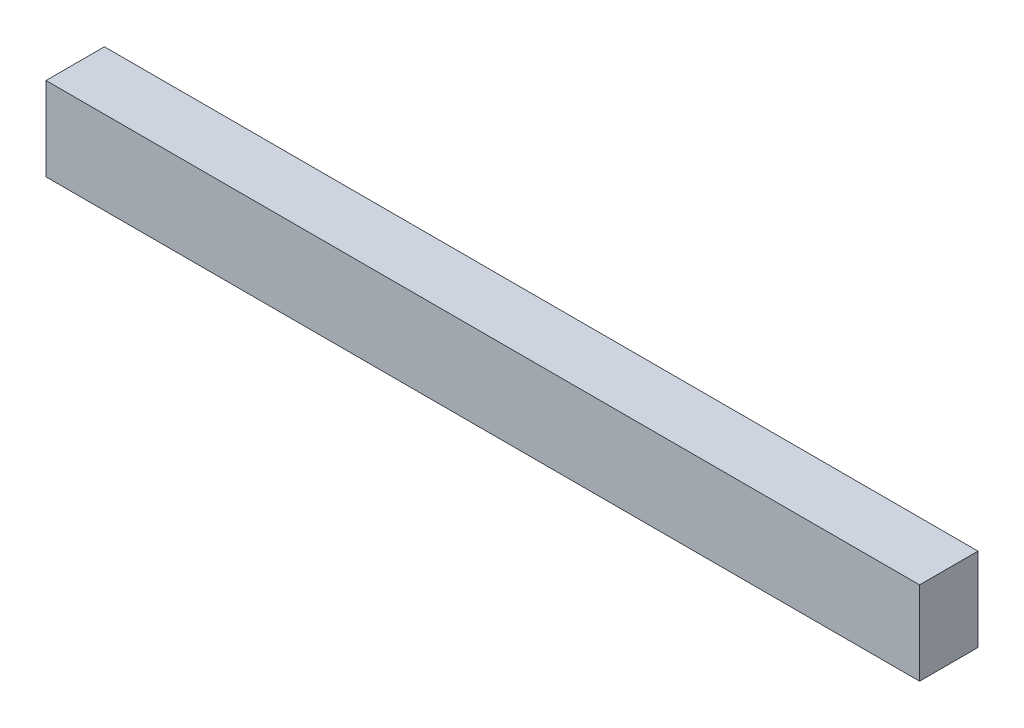
ISO-10303-21;
HEADER;
FILE_DESCRIPTION(('STEP AP214'),'2;1');
FILE_NAME('part.step','',(''),(''),'','','');
FILE_SCHEMA(('AUTOMOTIVE_DESIGN { 1 0 10303 214 1 1 1 1 }'));
ENDSEC;
DATA;
#1=APPLICATION_CONTEXT('core data for automotive mechanical design processes');
#2=APPLICATION_PROTOCOL_DEFINITION('international standard','automotive_design',2000,#1);
#3=PRODUCT_CONTEXT('',#1,'mechanical');
#4=PRODUCT('Part','Part','',(#3));
#5=PRODUCT_RELATED_PRODUCT_CATEGORY('part','',(#4));
#6=PRODUCT_DEFINITION_FORMATION('','',#4);
#7=PRODUCT_DEFINITION_CONTEXT('part definition',#1,'design');
#8=PRODUCT_DEFINITION('design','',#6,#7);
#9=PRODUCT_DEFINITION_SHAPE('','',#8);
#10=(LENGTH_UNIT() NAMED_UNIT(*) SI_UNIT(.MILLI.,.METRE.));
#11=(NAMED_UNIT(*) PLANE_ANGLE_UNIT() SI_UNIT($,.RADIAN.));
#12=(NAMED_UNIT(*) SI_UNIT($,.STERADIAN.) SOLID_ANGLE_UNIT());
#13=UNCERTAINTY_MEASURE_WITH_UNIT(LENGTH_MEASURE(1.E-05),#10,'distance_accuracy_value','');
#14=(GEOMETRIC_REPRESENTATION_CONTEXT(3) GLOBAL_UNCERTAINTY_ASSIGNED_CONTEXT((#13)) GLOBAL_UNIT_ASSIGNED_CONTEXT((#10,
#11,#12)) REPRESENTATION_CONTEXT('',''));
#15=CARTESIAN_POINT('',(0.,0.,0.));
#16=DIRECTION('',(0.,0.,1.));
#17=DIRECTION('',(1.,0.,0.));
#18=AXIS2_PLACEMENT_3D('',#15,#16,#17);
#19=CARTESIAN_POINT('',(-17.6758170110822,23.3380129589633,21.));
#20=DIRECTION('',(1.,0.,0.));
#21=DIRECTION('',(0.,0.,-1.));
#22=AXIS2_PLACEMENT_3D('',#19,#20,#21);
#23=PLANE('',#22);
#24=DIRECTION('',(0.,-1.,0.));
#25=VECTOR('',#24,1.);
#26=CARTESIAN_POINT('',(-17.6758170110822,23.3380129589633,0.));
#27=LINE('',#26,#25);
#28=CARTESIAN_POINT('',(-17.6758170110822,23.3380129589633,0.));
#29=VERTEX_POINT('',#28);
#30=CARTESIAN_POINT('',(-17.6758170110822,-6.66198704103671,0.));
#31=VERTEX_POINT('',#30);
#32=EDGE_CURVE('E103',#29,#31,#27,.T.);
#33=ORIENTED_EDGE('',*,*,#32,.T.);
#34=DIRECTION('',(0.,0.,-1.));
#35=VECTOR('',#34,1.);
#36=CARTESIAN_POINT('',(-17.6758170110822,-6.66198704103671,21.));
#37=LINE('',#36,#35);
#38=CARTESIAN_POINT('',(-17.6758170110822,-6.66198704103671,21.));
#39=VERTEX_POINT('',#38);
#40=EDGE_CURVE('E11',#39,#31,#37,.T.);
#41=ORIENTED_EDGE('',*,*,#40,.F.);
#42=DIRECTION('',(0.,-1.,0.));
#43=VECTOR('',#42,1.);
#44=CARTESIAN_POINT('',(-17.6758170110822,23.3380129589633,21.));
#45=LINE('',#44,#43);
#46=CARTESIAN_POINT('',(-17.6758170110822,23.3380129589633,21.));
#47=VERTEX_POINT('',#46);
#48=EDGE_CURVE('E91',#47,#39,#45,.T.);
#49=ORIENTED_EDGE('',*,*,#48,.F.);
#50=DIRECTION('',(0.,0.,-1.));
#51=VECTOR('',#50,1.);
#52=CARTESIAN_POINT('',(-17.6758170110822,23.3380129589633,21.));
#53=LINE('',#52,#51);
#54=EDGE_CURVE('E99',#47,#29,#53,.T.);
#55=ORIENTED_EDGE('',*,*,#54,.T.);
#56=EDGE_LOOP('',(#33,#41,#49,#55));
#57=FACE_BOUND('',#56,.T.);
#58=ADVANCED_FACE('F40',(#57),#23,.F.);
#59=CARTESIAN_POINT('',(-17.6758170110822,-6.66198704103671,21.));
#60=DIRECTION('',(0.,1.,0.));
#61=DIRECTION('',(0.,0.,1.));
#62=AXIS2_PLACEMENT_3D('',#59,#60,#61);
#63=PLANE('',#62);
#64=DIRECTION('',(1.,0.,0.));
#65=VECTOR('',#64,1.);
#66=CARTESIAN_POINT('',(-17.6758170110822,-6.66198704103671,0.));
#67=LINE('',#66,#65);
#68=CARTESIAN_POINT('',(296.324182988918,-6.66198704103671,0.));
#69=VERTEX_POINT('',#68);
#70=EDGE_CURVE('E95',#31,#69,#67,.T.);
#71=ORIENTED_EDGE('',*,*,#70,.T.);
#72=DIRECTION('',(0.,0.,-1.));
#73=VECTOR('',#72,1.);
#74=CARTESIAN_POINT('',(296.324182988918,-6.66198704103671,21.));
#75=LINE('',#74,#73);
#76=CARTESIAN_POINT('',(296.324182988918,-6.66198704103671,21.));
#77=VERTEX_POINT('',#76);
#78=EDGE_CURVE('E48',#77,#69,#75,.T.);
#79=ORIENTED_EDGE('',*,*,#78,.F.);
#80=DIRECTION('',(1.,0.,0.));
#81=VECTOR('',#80,1.);
#82=CARTESIAN_POINT('',(-17.6758170110822,-6.66198704103671,21.));
#83=LINE('',#82,#81);
#84=EDGE_CURVE('E86',#39,#77,#83,.T.);
#85=ORIENTED_EDGE('',*,*,#84,.F.);
#86=ORIENTED_EDGE('',*,*,#40,.T.);
#87=EDGE_LOOP('',(#71,#79,#85,#86));
#88=FACE_BOUND('',#87,.T.);
#89=ADVANCED_FACE('F94',(#88),#63,.F.);
#90=CARTESIAN_POINT('',(296.324182988918,23.3380129589633,21.));
#91=DIRECTION('',(-1.,0.,0.));
#92=DIRECTION('',(0.,0.,1.));
#93=AXIS2_PLACEMENT_3D('',#90,#91,#92);
#94=PLANE('',#93);
#95=DIRECTION('',(0.,1.,0.));
#96=VECTOR('',#95,1.);
#97=CARTESIAN_POINT('',(296.324182988918,23.3380129589633,0.));
#98=LINE('',#97,#96);
#99=CARTESIAN_POINT('',(296.324182988918,23.3380129589633,0.));
#100=VERTEX_POINT('',#99);
#101=EDGE_CURVE('E73',#69,#100,#98,.T.);
#102=ORIENTED_EDGE('',*,*,#101,.T.);
#103=DIRECTION('',(0.,0.,-1.));
#104=VECTOR('',#103,1.);
#105=CARTESIAN_POINT('',(296.324182988918,23.3380129589633,21.));
#106=LINE('',#105,#104);
#107=CARTESIAN_POINT('',(296.324182988918,23.3380129589633,21.));
#108=VERTEX_POINT('',#107);
#109=EDGE_CURVE('E96',#108,#100,#106,.T.);
#110=ORIENTED_EDGE('',*,*,#109,.F.);
#111=DIRECTION('',(0.,1.,0.));
#112=VECTOR('',#111,1.);
#113=CARTESIAN_POINT('',(296.324182988918,23.3380129589633,21.));
#114=LINE('',#113,#112);
#115=EDGE_CURVE('E89',#77,#108,#114,.T.);
#116=ORIENTED_EDGE('',*,*,#115,.F.);
#117=ORIENTED_EDGE('',*,*,#78,.T.);
#118=EDGE_LOOP('',(#102,#110,#116,#117));
#119=FACE_BOUND('',#118,.T.);
#120=ADVANCED_FACE('F97',(#119),#94,.F.);
#121=CARTESIAN_POINT('',(-17.6758170110822,23.3380129589633,21.));
#122=DIRECTION('',(0.,-1.,0.));
#123=DIRECTION('',(0.,0.,-1.));
#124=AXIS2_PLACEMENT_3D('',#121,#122,#123);
#125=PLANE('',#124);
#126=DIRECTION('',(-1.,0.,0.));
#127=VECTOR('',#126,1.);
#128=CARTESIAN_POINT('',(-17.6758170110822,23.3380129589633,0.));
#129=LINE('',#128,#127);
#130=EDGE_CURVE('E79',#100,#29,#129,.T.);
#131=ORIENTED_EDGE('',*,*,#130,.T.);
#132=ORIENTED_EDGE('',*,*,#54,.F.);
#133=DIRECTION('',(-1.,0.,0.));
#134=VECTOR('',#133,1.);
#135=CARTESIAN_POINT('',(-17.6758170110822,23.3380129589633,21.));
#136=LINE('',#135,#134);
#137=EDGE_CURVE('E56',#108,#47,#136,.T.);
#138=ORIENTED_EDGE('',*,*,#137,.F.);
#139=ORIENTED_EDGE('',*,*,#109,.T.);
#140=EDGE_LOOP('',(#131,#132,#138,#139));
#141=FACE_BOUND('',#140,.T.);
#142=ADVANCED_FACE('F110',(#141),#125,.F.);
#143=CARTESIAN_POINT('',(0.,0.,21.));
#144=DIRECTION('',(0.,0.,1.));
#145=DIRECTION('',(1.,0.,0.));
#146=AXIS2_PLACEMENT_3D('',#143,#144,#145);
#147=PLANE('',#146);
#148=ORIENTED_EDGE('',*,*,#48,.T.);
#149=ORIENTED_EDGE('',*,*,#84,.T.);
#150=ORIENTED_EDGE('',*,*,#115,.T.);
#151=ORIENTED_EDGE('',*,*,#137,.T.);
#152=EDGE_LOOP('',(#148,#149,#150,#151));
#153=FACE_BOUND('',#152,.T.);
#154=ADVANCED_FACE('F87',(#153),#147,.T.);
#155=CARTESIAN_POINT('',(0.,0.,0.));
#156=DIRECTION('',(0.,0.,1.));
#157=DIRECTION('',(1.,0.,0.));
#158=AXIS2_PLACEMENT_3D('',#155,#156,#157);
#159=PLANE('',#158);
#160=ORIENTED_EDGE('',*,*,#32,.F.);
#161=ORIENTED_EDGE('',*,*,#130,.F.);
#162=ORIENTED_EDGE('',*,*,#101,.F.);
#163=ORIENTED_EDGE('',*,*,#70,.F.);
#164=EDGE_LOOP('',(#160,#161,#162,#163));
#165=FACE_BOUND('',#164,.T.);
#166=ADVANCED_FACE('F113',(#165),#159,.F.);
#167=CLOSED_SHELL('',(#58,#89,#120,#142,#154,#166));
#168=MANIFOLD_SOLID_BREP('B2',#167);
#169=ADVANCED_BREP_SHAPE_REPRESENTATION('',(#18,#168),#14);
#170=SHAPE_DEFINITION_REPRESENTATION(#9,#169);
ENDSEC;
END-ISO-10303-21;
